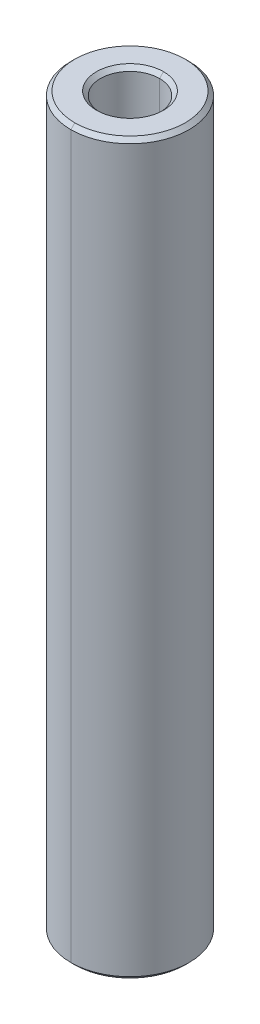
ISO-10303-21;
HEADER;
FILE_DESCRIPTION(('STEP AP214'),'2;1');
FILE_NAME('part.step','',(''),(''),'','','');
FILE_SCHEMA(('AUTOMOTIVE_DESIGN { 1 0 10303 214 1 1 1 1 }'));
ENDSEC;
DATA;
#1=APPLICATION_CONTEXT('core data for automotive mechanical design processes');
#2=APPLICATION_PROTOCOL_DEFINITION('international standard','automotive_design',2000,#1);
#3=PRODUCT_CONTEXT('',#1,'mechanical');
#4=PRODUCT('Part','Part','',(#3));
#5=PRODUCT_RELATED_PRODUCT_CATEGORY('part','',(#4));
#6=PRODUCT_DEFINITION_FORMATION('','',#4);
#7=PRODUCT_DEFINITION_CONTEXT('part definition',#1,'design');
#8=PRODUCT_DEFINITION('design','',#6,#7);
#9=PRODUCT_DEFINITION_SHAPE('','',#8);
#10=(LENGTH_UNIT() NAMED_UNIT(*) SI_UNIT(.MILLI.,.METRE.));
#11=(NAMED_UNIT(*) PLANE_ANGLE_UNIT() SI_UNIT($,.RADIAN.));
#12=(NAMED_UNIT(*) SI_UNIT($,.STERADIAN.) SOLID_ANGLE_UNIT());
#13=UNCERTAINTY_MEASURE_WITH_UNIT(LENGTH_MEASURE(1.E-05),#10,'distance_accuracy_value','');
#14=(GEOMETRIC_REPRESENTATION_CONTEXT(3) GLOBAL_UNCERTAINTY_ASSIGNED_CONTEXT((#13)) GLOBAL_UNIT_ASSIGNED_CONTEXT((#10,
#11,#12)) REPRESENTATION_CONTEXT('',''));
#15=CARTESIAN_POINT('',(0.,0.,0.));
#16=DIRECTION('',(0.,0.,1.));
#17=DIRECTION('',(1.,0.,0.));
#18=AXIS2_PLACEMENT_3D('',#15,#16,#17);
#19=CARTESIAN_POINT('',(0.,37.,0.));
#20=DIRECTION('',(0.,-1.,0.));
#21=DIRECTION('',(0.,0.,-1.));
#22=AXIS2_PLACEMENT_3D('',#19,#20,#21);
#23=PLANE('',#22);
#24=CARTESIAN_POINT('',(0.,37.,0.));
#25=DIRECTION('',(0.,-1.,0.));
#26=DIRECTION('',(0.,0.,-1.));
#27=AXIS2_PLACEMENT_3D('',#24,#25,#26);
#28=CIRCLE('',#27,2.8);
#29=CARTESIAN_POINT('',(0.,37.,2.8));
#30=VERTEX_POINT('',#29);
#31=CARTESIAN_POINT('',(0.,37.,-2.8));
#32=VERTEX_POINT('',#31);
#33=EDGE_CURVE('E11',#30,#32,#28,.T.);
#34=ORIENTED_EDGE('',*,*,#33,.F.);
#35=CARTESIAN_POINT('',(0.,37.,0.));
#36=DIRECTION('',(0.,-1.,0.));
#37=DIRECTION('',(0.,0.,-1.));
#38=AXIS2_PLACEMENT_3D('',#35,#36,#37);
#39=CIRCLE('',#38,2.8);
#40=EDGE_CURVE('E25',#32,#30,#39,.T.);
#41=ORIENTED_EDGE('',*,*,#40,.F.);
#42=EDGE_LOOP('',(#34,#41));
#43=FACE_BOUND('',#42,.T.);
#44=CARTESIAN_POINT('',(0.,37.,0.));
#45=DIRECTION('',(0.,-1.,0.));
#46=DIRECTION('',(0.,0.,-1.));
#47=AXIS2_PLACEMENT_3D('',#44,#45,#46);
#48=CIRCLE('',#47,1.7);
#49=CARTESIAN_POINT('',(0.,37.,-1.7));
#50=VERTEX_POINT('',#49);
#51=CARTESIAN_POINT('',(0.,37.,1.7));
#52=VERTEX_POINT('',#51);
#53=EDGE_CURVE('E194',#50,#52,#48,.T.);
#54=ORIENTED_EDGE('',*,*,#53,.T.);
#55=CARTESIAN_POINT('',(0.,37.,0.));
#56=DIRECTION('',(0.,-1.,0.));
#57=DIRECTION('',(0.,0.,-1.));
#58=AXIS2_PLACEMENT_3D('',#55,#56,#57);
#59=CIRCLE('',#58,1.7);
#60=EDGE_CURVE('E190',#52,#50,#59,.T.);
#61=ORIENTED_EDGE('',*,*,#60,.T.);
#62=EDGE_LOOP('',(#54,#61));
#63=FACE_BOUND('',#62,.T.);
#64=ADVANCED_FACE('F17',(#43,#63),#23,.F.);
#65=CARTESIAN_POINT('',(0.,37.,0.));
#66=DIRECTION('',(0.,1.,0.));
#67=DIRECTION('',(1.,0.,0.));
#68=AXIS2_PLACEMENT_3D('',#65,#66,#67);
#69=CONICAL_SURFACE('',#68,1.7,0.785398163397451);
#70=DIRECTION('',(0.,0.707106781186549,-0.707106781186546));
#71=VECTOR('',#70,1.);
#72=CARTESIAN_POINT('',(0.,36.8,-1.5));
#73=LINE('',#72,#71);
#74=CARTESIAN_POINT('',(0.,36.8,-1.5));
#75=VERTEX_POINT('',#74);
#76=EDGE_CURVE('E185',#75,#50,#73,.T.);
#77=ORIENTED_EDGE('',*,*,#76,.T.);
#78=ORIENTED_EDGE('',*,*,#60,.F.);
#79=DIRECTION('',(0.,0.707106781186549,0.707106781186546));
#80=VECTOR('',#79,1.);
#81=CARTESIAN_POINT('',(0.,36.8,1.5));
#82=LINE('',#81,#80);
#83=CARTESIAN_POINT('',(0.,36.8,1.5));
#84=VERTEX_POINT('',#83);
#85=EDGE_CURVE('E180',#84,#52,#82,.T.);
#86=ORIENTED_EDGE('',*,*,#85,.F.);
#87=CARTESIAN_POINT('',(0.,36.8,0.));
#88=DIRECTION('',(0.,-1.,0.));
#89=DIRECTION('',(0.,0.,-1.));
#90=AXIS2_PLACEMENT_3D('',#87,#88,#89);
#91=CIRCLE('',#90,1.5);
#92=EDGE_CURVE('E176',#84,#75,#91,.T.);
#93=ORIENTED_EDGE('',*,*,#92,.T.);
#94=EDGE_LOOP('',(#77,#78,#86,#93));
#95=FACE_BOUND('',#94,.T.);
#96=ADVANCED_FACE('F211',(#95),#69,.F.);
#97=CARTESIAN_POINT('',(0.,0.,0.));
#98=DIRECTION('',(0.,-1.,0.));
#99=DIRECTION('',(1.,0.,0.));
#100=AXIS2_PLACEMENT_3D('',#97,#98,#99);
#101=CYLINDRICAL_SURFACE('',#100,1.5);
#102=DIRECTION('',(0.,-1.,0.));
#103=VECTOR('',#102,1.);
#104=CARTESIAN_POINT('',(0.,36.8,1.5));
#105=LINE('',#104,#103);
#106=CARTESIAN_POINT('',(0.,0.200000000000031,1.5));
#107=VERTEX_POINT('',#106);
#108=EDGE_CURVE('E172',#84,#107,#105,.T.);
#109=ORIENTED_EDGE('',*,*,#108,.T.);
#110=CARTESIAN_POINT('',(0.,0.2,0.));
#111=DIRECTION('',(0.,-1.,0.));
#112=DIRECTION('',(0.,0.,-1.));
#113=AXIS2_PLACEMENT_3D('',#110,#111,#112);
#114=CIRCLE('',#113,1.5);
#115=CARTESIAN_POINT('',(0.,0.2,-1.5));
#116=VERTEX_POINT('',#115);
#117=EDGE_CURVE('E168',#107,#116,#114,.T.);
#118=ORIENTED_EDGE('',*,*,#117,.T.);
#119=DIRECTION('',(0.,-1.,0.));
#120=VECTOR('',#119,1.);
#121=CARTESIAN_POINT('',(0.,36.8,-1.5));
#122=LINE('',#121,#120);
#123=EDGE_CURVE('E163',#75,#116,#122,.T.);
#124=ORIENTED_EDGE('',*,*,#123,.F.);
#125=ORIENTED_EDGE('',*,*,#92,.F.);
#126=EDGE_LOOP('',(#109,#118,#124,#125));
#127=FACE_BOUND('',#126,.T.);
#128=ADVANCED_FACE('F215',(#127),#101,.F.);
#129=CARTESIAN_POINT('',(0.,0.,0.));
#130=DIRECTION('',(0.,-1.,0.));
#131=DIRECTION('',(-1.,0.,0.));
#132=AXIS2_PLACEMENT_3D('',#129,#130,#131);
#133=CYLINDRICAL_SURFACE('',#132,1.5);
#134=ORIENTED_EDGE('',*,*,#108,.F.);
#135=CARTESIAN_POINT('',(0.,36.8,0.));
#136=DIRECTION('',(0.,-1.,0.));
#137=DIRECTION('',(0.,0.,-1.));
#138=AXIS2_PLACEMENT_3D('',#135,#136,#137);
#139=CIRCLE('',#138,1.5);
#140=EDGE_CURVE('E158',#75,#84,#139,.T.);
#141=ORIENTED_EDGE('',*,*,#140,.F.);
#142=ORIENTED_EDGE('',*,*,#123,.T.);
#143=CARTESIAN_POINT('',(0.,0.2,0.));
#144=DIRECTION('',(0.,-1.,0.));
#145=DIRECTION('',(0.,0.,-1.));
#146=AXIS2_PLACEMENT_3D('',#143,#144,#145);
#147=CIRCLE('',#146,1.5);
#148=EDGE_CURVE('E153',#116,#107,#147,.T.);
#149=ORIENTED_EDGE('',*,*,#148,.T.);
#150=EDGE_LOOP('',(#134,#141,#142,#149));
#151=FACE_BOUND('',#150,.T.);
#152=ADVANCED_FACE('F219',(#151),#133,.F.);
#153=CARTESIAN_POINT('',(0.,0.2,0.));
#154=DIRECTION('',(0.,-1.,0.));
#155=DIRECTION('',(-1.,0.,0.));
#156=AXIS2_PLACEMENT_3D('',#153,#154,#155);
#157=CONICAL_SURFACE('',#156,1.5,0.785398163397451);
#158=DIRECTION('',(0.,-0.707106781186546,0.707106781186549));
#159=VECTOR('',#158,1.);
#160=CARTESIAN_POINT('',(0.,0.2,1.5));
#161=LINE('',#160,#159);
#162=CARTESIAN_POINT('',(0.,0.,1.7));
#163=VERTEX_POINT('',#162);
#164=EDGE_CURVE('E148',#107,#163,#161,.T.);
#165=ORIENTED_EDGE('',*,*,#164,.F.);
#166=ORIENTED_EDGE('',*,*,#148,.F.);
#167=DIRECTION('',(0.,-0.707106781186546,-0.707106781186549));
#168=VECTOR('',#167,1.);
#169=CARTESIAN_POINT('',(0.,0.2,-1.5));
#170=LINE('',#169,#168);
#171=CARTESIAN_POINT('',(0.,0.,-1.7));
#172=VERTEX_POINT('',#171);
#173=EDGE_CURVE('E144',#116,#172,#170,.T.);
#174=ORIENTED_EDGE('',*,*,#173,.T.);
#175=CARTESIAN_POINT('',(0.,0.,0.));
#176=DIRECTION('',(0.,-1.,0.));
#177=DIRECTION('',(0.,0.,-1.));
#178=AXIS2_PLACEMENT_3D('',#175,#176,#177);
#179=CIRCLE('',#178,1.7);
#180=EDGE_CURVE('E140',#172,#163,#179,.T.);
#181=ORIENTED_EDGE('',*,*,#180,.T.);
#182=EDGE_LOOP('',(#165,#166,#174,#181));
#183=FACE_BOUND('',#182,.T.);
#184=ADVANCED_FACE('F223',(#183),#157,.F.);
#185=CARTESIAN_POINT('',(2.8,0.,0.));
#186=DIRECTION('',(0.,1.,0.));
#187=DIRECTION('',(0.,0.,1.));
#188=AXIS2_PLACEMENT_3D('',#185,#186,#187);
#189=PLANE('',#188);
#190=CARTESIAN_POINT('',(0.,0.,0.));
#191=DIRECTION('',(0.,-1.,0.));
#192=DIRECTION('',(0.,0.,-1.));
#193=AXIS2_PLACEMENT_3D('',#190,#191,#192);
#194=CIRCLE('',#193,1.7);
#195=EDGE_CURVE('E135',#163,#172,#194,.T.);
#196=ORIENTED_EDGE('',*,*,#195,.F.);
#197=ORIENTED_EDGE('',*,*,#180,.F.);
#198=EDGE_LOOP('',(#196,#197));
#199=FACE_BOUND('',#198,.T.);
#200=CARTESIAN_POINT('',(0.,0.,0.));
#201=DIRECTION('',(0.,-1.,0.));
#202=DIRECTION('',(0.,0.,-1.));
#203=AXIS2_PLACEMENT_3D('',#200,#201,#202);
#204=CIRCLE('',#203,2.8);
#205=CARTESIAN_POINT('',(0.,0.,-2.8));
#206=VERTEX_POINT('',#205);
#207=CARTESIAN_POINT('',(0.,0.,2.8));
#208=VERTEX_POINT('',#207);
#209=EDGE_CURVE('E131',#206,#208,#204,.T.);
#210=ORIENTED_EDGE('',*,*,#209,.T.);
#211=CARTESIAN_POINT('',(0.,0.,0.));
#212=DIRECTION('',(0.,-1.,0.));
#213=DIRECTION('',(0.,0.,-1.));
#214=AXIS2_PLACEMENT_3D('',#211,#212,#213);
#215=CIRCLE('',#214,2.8);
#216=EDGE_CURVE('E127',#208,#206,#215,.T.);
#217=ORIENTED_EDGE('',*,*,#216,.T.);
#218=EDGE_LOOP('',(#210,#217));
#219=FACE_BOUND('',#218,.T.);
#220=ADVANCED_FACE('F229',(#199,#219),#189,.F.);
#221=CARTESIAN_POINT('',(0.,0.2,0.));
#222=DIRECTION('',(0.,1.,0.));
#223=DIRECTION('',(1.,0.,0.));
#224=AXIS2_PLACEMENT_3D('',#221,#222,#223);
#225=CONICAL_SURFACE('',#224,3.,0.785398163397452);
#226=DIRECTION('',(0.,0.707106781186545,-0.70710678118655));
#227=VECTOR('',#226,1.);
#228=CARTESIAN_POINT('',(0.,0.,-2.8));
#229=LINE('',#228,#227);
#230=CARTESIAN_POINT('',(0.,0.2,-3.));
#231=VERTEX_POINT('',#230);
#232=EDGE_CURVE('E123',#206,#231,#229,.T.);
#233=ORIENTED_EDGE('',*,*,#232,.F.);
#234=ORIENTED_EDGE('',*,*,#216,.F.);
#235=DIRECTION('',(0.,0.707106781186545,0.70710678118655));
#236=VECTOR('',#235,1.);
#237=CARTESIAN_POINT('',(0.,0.,2.8));
#238=LINE('',#237,#236);
#239=CARTESIAN_POINT('',(0.,0.2,3.));
#240=VERTEX_POINT('',#239);
#241=EDGE_CURVE('E119',#208,#240,#238,.T.);
#242=ORIENTED_EDGE('',*,*,#241,.T.);
#243=CARTESIAN_POINT('',(0.,0.2,0.));
#244=DIRECTION('',(0.,-1.,0.));
#245=DIRECTION('',(0.,0.,-1.));
#246=AXIS2_PLACEMENT_3D('',#243,#244,#245);
#247=CIRCLE('',#246,3.);
#248=EDGE_CURVE('E115',#240,#231,#247,.T.);
#249=ORIENTED_EDGE('',*,*,#248,.T.);
#250=EDGE_LOOP('',(#233,#234,#242,#249));
#251=FACE_BOUND('',#250,.T.);
#252=ADVANCED_FACE('F232',(#251),#225,.T.);
#253=CARTESIAN_POINT('',(0.,0.,0.));
#254=DIRECTION('',(0.,-1.,0.));
#255=DIRECTION('',(1.,0.,-1.61702923845784E-09));
#256=AXIS2_PLACEMENT_3D('',#253,#254,#255);
#257=CYLINDRICAL_SURFACE('',#256,3.);
#258=DIRECTION('',(0.,-1.,0.));
#259=VECTOR('',#258,1.);
#260=CARTESIAN_POINT('',(0.,36.8,3.));
#261=LINE('',#260,#259);
#262=CARTESIAN_POINT('',(0.,36.8,3.));
#263=VERTEX_POINT('',#262);
#264=EDGE_CURVE('E86',#263,#240,#261,.T.);
#265=ORIENTED_EDGE('',*,*,#264,.F.);
#266=CARTESIAN_POINT('',(0.,36.8,0.));
#267=DIRECTION('',(0.,-1.,0.));
#268=DIRECTION('',(0.,0.,-1.));
#269=AXIS2_PLACEMENT_3D('',#266,#267,#268);
#270=CIRCLE('',#269,3.);
#271=CARTESIAN_POINT('',(0.,36.8,-3.));
#272=VERTEX_POINT('',#271);
#273=EDGE_CURVE('E78',#263,#272,#270,.T.);
#274=ORIENTED_EDGE('',*,*,#273,.T.);
#275=DIRECTION('',(0.,-1.,0.));
#276=VECTOR('',#275,1.);
#277=CARTESIAN_POINT('',(0.,36.8,-3.));
#278=LINE('',#277,#276);
#279=EDGE_CURVE('E83',#272,#231,#278,.T.);
#280=ORIENTED_EDGE('',*,*,#279,.T.);
#281=ORIENTED_EDGE('',*,*,#248,.F.);
#282=EDGE_LOOP('',(#265,#274,#280,#281));
#283=FACE_BOUND('',#282,.T.);
#284=ADVANCED_FACE('F80',(#283),#257,.T.);
#285=CARTESIAN_POINT('',(0.,0.,0.));
#286=DIRECTION('',(0.,-1.,0.));
#287=DIRECTION('',(-1.,0.,0.));
#288=AXIS2_PLACEMENT_3D('',#285,#286,#287);
#289=CYLINDRICAL_SURFACE('',#288,3.);
#290=ORIENTED_EDGE('',*,*,#264,.T.);
#291=CARTESIAN_POINT('',(0.,0.2,0.));
#292=DIRECTION('',(0.,-1.,0.));
#293=DIRECTION('',(0.,0.,-1.));
#294=AXIS2_PLACEMENT_3D('',#291,#292,#293);
#295=CIRCLE('',#294,3.);
#296=EDGE_CURVE('E100',#231,#240,#295,.T.);
#297=ORIENTED_EDGE('',*,*,#296,.F.);
#298=ORIENTED_EDGE('',*,*,#279,.F.);
#299=CARTESIAN_POINT('',(0.,36.8,0.));
#300=DIRECTION('',(0.,-1.,0.));
#301=DIRECTION('',(0.,0.,-1.));
#302=AXIS2_PLACEMENT_3D('',#299,#300,#301);
#303=CIRCLE('',#302,3.);
#304=EDGE_CURVE('E97',#272,#263,#303,.T.);
#305=ORIENTED_EDGE('',*,*,#304,.T.);
#306=EDGE_LOOP('',(#290,#297,#298,#305));
#307=FACE_BOUND('',#306,.T.);
#308=ADVANCED_FACE('F102',(#307),#289,.T.);
#309=CARTESIAN_POINT('',(0.,37.,0.));
#310=DIRECTION('',(0.,-1.,0.));
#311=DIRECTION('',(-1.,0.,0.));
#312=AXIS2_PLACEMENT_3D('',#309,#310,#311);
#313=CONICAL_SURFACE('',#312,2.8,0.785398163397452);
#314=DIRECTION('',(0.,-0.707106781186548,0.707106781186547));
#315=VECTOR('',#314,1.);
#316=CARTESIAN_POINT('',(0.,37.,2.8));
#317=LINE('',#316,#315);
#318=EDGE_CURVE('E94',#30,#263,#317,.T.);
#319=ORIENTED_EDGE('',*,*,#318,.T.);
#320=ORIENTED_EDGE('',*,*,#304,.F.);
#321=DIRECTION('',(0.,-0.707106781186548,-0.707106781186547));
#322=VECTOR('',#321,1.);
#323=CARTESIAN_POINT('',(0.,37.,-2.8));
#324=LINE('',#323,#322);
#325=EDGE_CURVE('E90',#32,#272,#324,.T.);
#326=ORIENTED_EDGE('',*,*,#325,.F.);
#327=ORIENTED_EDGE('',*,*,#40,.T.);
#328=EDGE_LOOP('',(#319,#320,#326,#327));
#329=FACE_BOUND('',#328,.T.);
#330=ADVANCED_FACE('F98',(#329),#313,.T.);
#331=CARTESIAN_POINT('',(0.,37.,0.));
#332=DIRECTION('',(0.,-1.,0.));
#333=DIRECTION('',(1.,0.,0.));
#334=AXIS2_PLACEMENT_3D('',#331,#332,#333);
#335=CONICAL_SURFACE('',#334,2.8,0.785398163397452);
#336=ORIENTED_EDGE('',*,*,#318,.F.);
#337=ORIENTED_EDGE('',*,*,#33,.T.);
#338=ORIENTED_EDGE('',*,*,#325,.T.);
#339=ORIENTED_EDGE('',*,*,#273,.F.);
#340=EDGE_LOOP('',(#336,#337,#338,#339));
#341=FACE_BOUND('',#340,.T.);
#342=ADVANCED_FACE('F92',(#341),#335,.T.);
#343=CARTESIAN_POINT('',(0.,0.2,0.));
#344=DIRECTION('',(0.,1.,0.));
#345=DIRECTION('',(-1.,0.,0.));
#346=AXIS2_PLACEMENT_3D('',#343,#344,#345);
#347=CONICAL_SURFACE('',#346,3.,0.785398163397452);
#348=ORIENTED_EDGE('',*,*,#232,.T.);
#349=ORIENTED_EDGE('',*,*,#296,.T.);
#350=ORIENTED_EDGE('',*,*,#241,.F.);
#351=ORIENTED_EDGE('',*,*,#209,.F.);
#352=EDGE_LOOP('',(#348,#349,#350,#351));
#353=FACE_BOUND('',#352,.T.);
#354=ADVANCED_FACE('F239',(#353),#347,.T.);
#355=CARTESIAN_POINT('',(0.,0.2,0.));
#356=DIRECTION('',(0.,-1.,0.));
#357=DIRECTION('',(1.,0.,0.));
#358=AXIS2_PLACEMENT_3D('',#355,#356,#357);
#359=CONICAL_SURFACE('',#358,1.5,0.785398163397451);
#360=ORIENTED_EDGE('',*,*,#164,.T.);
#361=ORIENTED_EDGE('',*,*,#195,.T.);
#362=ORIENTED_EDGE('',*,*,#173,.F.);
#363=ORIENTED_EDGE('',*,*,#117,.F.);
#364=EDGE_LOOP('',(#360,#361,#362,#363));
#365=FACE_BOUND('',#364,.T.);
#366=ADVANCED_FACE('F227',(#365),#359,.F.);
#367=CARTESIAN_POINT('',(0.,37.,0.));
#368=DIRECTION('',(0.,1.,0.));
#369=DIRECTION('',(-1.,0.,0.));
#370=AXIS2_PLACEMENT_3D('',#367,#368,#369);
#371=CONICAL_SURFACE('',#370,1.7,0.785398163397451);
#372=ORIENTED_EDGE('',*,*,#76,.F.);
#373=ORIENTED_EDGE('',*,*,#140,.T.);
#374=ORIENTED_EDGE('',*,*,#85,.T.);
#375=ORIENTED_EDGE('',*,*,#53,.F.);
#376=EDGE_LOOP('',(#372,#373,#374,#375));
#377=FACE_BOUND('',#376,.T.);
#378=ADVANCED_FACE('F207',(#377),#371,.F.);
#379=CLOSED_SHELL('',(#64,#96,#128,#152,#184,#220,#252,#284,#308,#330,#342,#354,#366,#378));
#380=MANIFOLD_SOLID_BREP('B1',#379);
#381=ADVANCED_BREP_SHAPE_REPRESENTATION('',(#18,#380),#14);
#382=SHAPE_DEFINITION_REPRESENTATION(#9,#381);
ENDSEC;
END-ISO-10303-21;
